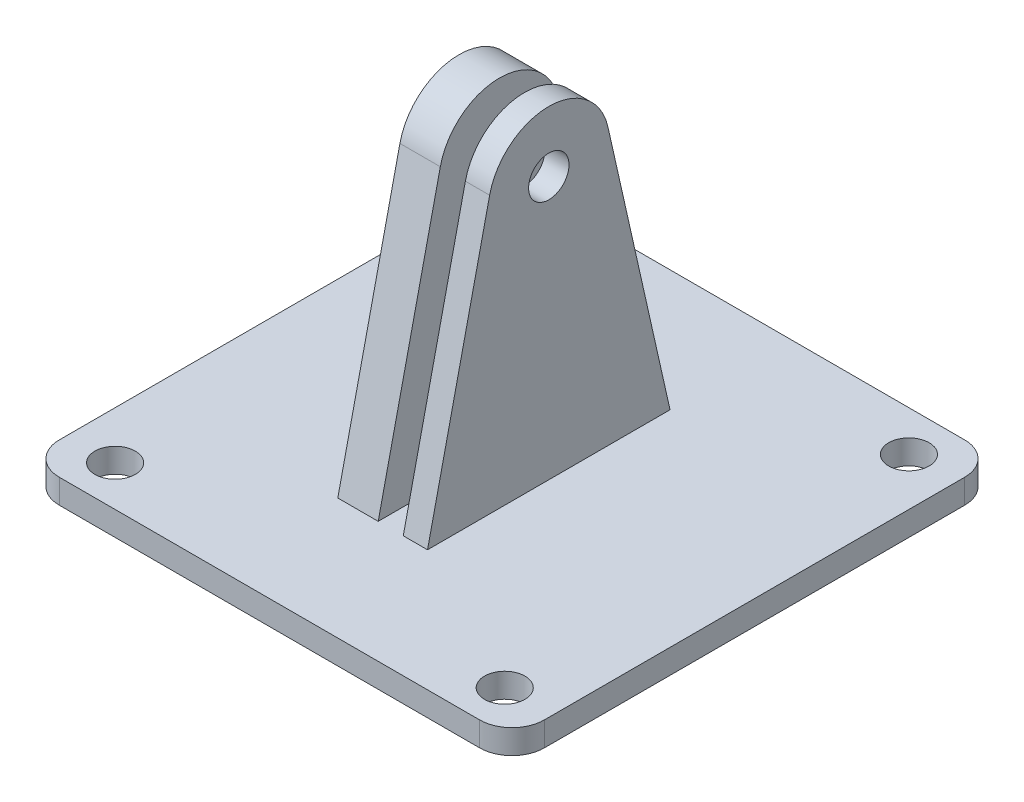
ISO-10303-21;
HEADER;
FILE_DESCRIPTION(('STEP AP214'),'2;1');
FILE_NAME('part.step','',(''),(''),'','','');
FILE_SCHEMA(('AUTOMOTIVE_DESIGN { 1 0 10303 214 1 1 1 1 }'));
ENDSEC;
DATA;
#1=APPLICATION_CONTEXT('core data for automotive mechanical design processes');
#2=APPLICATION_PROTOCOL_DEFINITION('international standard','automotive_design',2000,#1);
#3=PRODUCT_CONTEXT('',#1,'mechanical');
#4=PRODUCT('Part','Part','',(#3));
#5=PRODUCT_RELATED_PRODUCT_CATEGORY('part','',(#4));
#6=PRODUCT_DEFINITION_FORMATION('','',#4);
#7=PRODUCT_DEFINITION_CONTEXT('part definition',#1,'design');
#8=PRODUCT_DEFINITION('design','',#6,#7);
#9=PRODUCT_DEFINITION_SHAPE('','',#8);
#10=(LENGTH_UNIT() NAMED_UNIT(*) SI_UNIT(.MILLI.,.METRE.));
#11=(NAMED_UNIT(*) PLANE_ANGLE_UNIT() SI_UNIT($,.RADIAN.));
#12=(NAMED_UNIT(*) SI_UNIT($,.STERADIAN.) SOLID_ANGLE_UNIT());
#13=UNCERTAINTY_MEASURE_WITH_UNIT(LENGTH_MEASURE(1.E-05),#10,'distance_accuracy_value','');
#14=(GEOMETRIC_REPRESENTATION_CONTEXT(3) GLOBAL_UNCERTAINTY_ASSIGNED_CONTEXT((#13)) GLOBAL_UNIT_ASSIGNED_CONTEXT((#10,
#11,#12)) REPRESENTATION_CONTEXT('',''));
#15=CARTESIAN_POINT('',(0.,0.,0.));
#16=DIRECTION('',(0.,0.,1.));
#17=DIRECTION('',(1.,0.,0.));
#18=AXIS2_PLACEMENT_3D('',#15,#16,#17);
#19=CARTESIAN_POINT('',(-15.,35.5,0.));
#20=DIRECTION('',(1.,0.,0.));
#21=DIRECTION('',(0.,0.,-1.));
#22=AXIS2_PLACEMENT_3D('',#19,#20,#21);
#23=CYLINDRICAL_SURFACE('',#22,2.5);
#24=CARTESIAN_POINT('',(-1.55,35.5,0.));
#25=DIRECTION('',(1.,0.,0.));
#26=DIRECTION('',(0.,0.,-1.));
#27=AXIS2_PLACEMENT_3D('',#24,#25,#26);
#28=CIRCLE('',#27,2.5);
#29=CARTESIAN_POINT('',(-1.55,35.5,-2.5));
#30=VERTEX_POINT('',#29);
#31=EDGE_CURVE('E248',#30,#30,#28,.T.);
#32=ORIENTED_EDGE('',*,*,#31,.T.);
#33=EDGE_LOOP('',(#32));
#34=FACE_BOUND('',#33,.T.);
#35=CARTESIAN_POINT('',(-3.55,35.5,0.));
#36=DIRECTION('',(-1.,0.,0.));
#37=DIRECTION('',(0.,0.,1.));
#38=AXIS2_PLACEMENT_3D('',#35,#36,#37);
#39=CIRCLE('',#38,2.5);
#40=CARTESIAN_POINT('',(-3.55,35.5,2.5));
#41=VERTEX_POINT('',#40);
#42=EDGE_CURVE('E41',#41,#41,#39,.F.);
#43=ORIENTED_EDGE('',*,*,#42,.F.);
#44=EDGE_LOOP('',(#43));
#45=FACE_BOUND('',#44,.T.);
#46=ADVANCED_FACE('F37',(#34,#45),#23,.F.);
#47=CARTESIAN_POINT('',(-15.,35.5,0.));
#48=DIRECTION('',(1.,0.,0.));
#49=DIRECTION('',(0.,0.,-1.));
#50=AXIS2_PLACEMENT_3D('',#47,#48,#49);
#51=CYLINDRICAL_SURFACE('',#50,7.5);
#52=DIRECTION('',(1.,0.,0.));
#53=VECTOR('',#52,1.);
#54=CARTESIAN_POINT('',(-15.,37.1463414634146,-7.3170731707317));
#55=LINE('',#54,#53);
#56=CARTESIAN_POINT('',(-6.55,37.1463414634146,-7.3170731707317));
#57=VERTEX_POINT('',#56);
#58=CARTESIAN_POINT('',(-1.55,37.1463414634146,-7.3170731707317));
#59=VERTEX_POINT('',#58);
#60=EDGE_CURVE('E279',#57,#59,#55,.T.);
#61=ORIENTED_EDGE('',*,*,#60,.F.);
#62=CARTESIAN_POINT('',(-6.55,35.5,0.));
#63=DIRECTION('',(-1.,0.,0.));
#64=DIRECTION('',(0.,0.,1.));
#65=AXIS2_PLACEMENT_3D('',#62,#63,#64);
#66=CIRCLE('',#65,7.5);
#67=CARTESIAN_POINT('',(-6.55,37.1463414634146,7.31707317073171));
#68=VERTEX_POINT('',#67);
#69=EDGE_CURVE('E272',#68,#57,#66,.T.);
#70=ORIENTED_EDGE('',*,*,#69,.F.);
#71=DIRECTION('',(1.,0.,0.));
#72=VECTOR('',#71,1.);
#73=CARTESIAN_POINT('',(-15.,37.1463414634146,7.31707317073171));
#74=LINE('',#73,#72);
#75=CARTESIAN_POINT('',(-1.55,37.1463414634146,7.31707317073171));
#76=VERTEX_POINT('',#75);
#77=EDGE_CURVE('E283',#68,#76,#74,.T.);
#78=ORIENTED_EDGE('',*,*,#77,.T.);
#79=CARTESIAN_POINT('',(-1.55,35.5,0.));
#80=DIRECTION('',(1.,0.,0.));
#81=DIRECTION('',(0.,0.,-1.));
#82=AXIS2_PLACEMENT_3D('',#79,#80,#81);
#83=CIRCLE('',#82,7.5);
#84=EDGE_CURVE('E264',#59,#76,#83,.T.);
#85=ORIENTED_EDGE('',*,*,#84,.F.);
#86=EDGE_LOOP('',(#61,#70,#78,#85));
#87=FACE_BOUND('',#86,.T.);
#88=ADVANCED_FACE('F420',(#87),#51,.T.);
#89=CARTESIAN_POINT('',(4.55,35.5,0.));
#90=DIRECTION('',(1.,0.,0.));
#91=DIRECTION('',(0.,0.,-1.));
#92=AXIS2_PLACEMENT_3D('',#89,#90,#91);
#93=CIRCLE('',#92,7.5);
#94=CARTESIAN_POINT('',(4.55,37.1463414634146,-7.3170731707317));
#95=VERTEX_POINT('',#94);
#96=CARTESIAN_POINT('',(4.55,37.1463414634146,7.31707317073171));
#97=VERTEX_POINT('',#96);
#98=EDGE_CURVE('E268',#95,#97,#93,.T.);
#99=ORIENTED_EDGE('',*,*,#98,.F.);
#100=CARTESIAN_POINT('',(1.55,37.1463414634146,-7.3170731707317));
#101=VERTEX_POINT('',#100);
#102=EDGE_CURVE('E276',#101,#95,#55,.T.);
#103=ORIENTED_EDGE('',*,*,#102,.F.);
#104=CARTESIAN_POINT('',(1.55,35.5,0.));
#105=DIRECTION('',(-1.,0.,0.));
#106=DIRECTION('',(0.,0.,1.));
#107=AXIS2_PLACEMENT_3D('',#104,#105,#106);
#108=CIRCLE('',#107,7.5);
#109=CARTESIAN_POINT('',(1.55,37.1463414634146,7.31707317073171));
#110=VERTEX_POINT('',#109);
#111=EDGE_CURVE('E253',#110,#101,#108,.T.);
#112=ORIENTED_EDGE('',*,*,#111,.F.);
#113=EDGE_CURVE('E280',#110,#97,#74,.T.);
#114=ORIENTED_EDGE('',*,*,#113,.T.);
#115=EDGE_LOOP('',(#99,#103,#112,#114));
#116=FACE_BOUND('',#115,.T.);
#117=ADVANCED_FACE('F393',(#116),#51,.T.);
#118=CARTESIAN_POINT('',(-15.,37.1463414634146,7.31707317073171));
#119=DIRECTION('',(0.,-0.219512195121951,-0.975609756097561));
#120=DIRECTION('',(0.,0.975609756097561,-0.219512195121951));
#121=AXIS2_PLACEMENT_3D('',#118,#119,#120);
#122=PLANE('',#121);
#123=DIRECTION('',(0.,0.975609756097561,-0.219512195121951));
#124=VECTOR('',#123,1.);
#125=CARTESIAN_POINT('',(-6.55,37.1463414634146,7.31707317073171));
#126=LINE('',#125,#124);
#127=CARTESIAN_POINT('',(-6.55,3.,15.));
#128=VERTEX_POINT('',#127);
#129=EDGE_CURVE('E274',#128,#68,#126,.T.);
#130=ORIENTED_EDGE('',*,*,#129,.F.);
#131=DIRECTION('',(1.,0.,0.));
#132=VECTOR('',#131,1.);
#133=CARTESIAN_POINT('',(-15.,3.,15.));
#134=LINE('',#133,#132);
#135=CARTESIAN_POINT('',(-1.55,3.,15.));
#136=VERTEX_POINT('',#135);
#137=EDGE_CURVE('E291',#128,#136,#134,.T.);
#138=ORIENTED_EDGE('',*,*,#137,.T.);
#139=DIRECTION('',(0.,-0.975609756097561,0.219512195121951));
#140=VECTOR('',#139,1.);
#141=CARTESIAN_POINT('',(-1.55,37.1463414634146,7.31707317073171));
#142=LINE('',#141,#140);
#143=EDGE_CURVE('E266',#76,#136,#142,.T.);
#144=ORIENTED_EDGE('',*,*,#143,.F.);
#145=ORIENTED_EDGE('',*,*,#77,.F.);
#146=EDGE_LOOP('',(#130,#138,#144,#145));
#147=FACE_BOUND('',#146,.T.);
#148=ADVANCED_FACE('F456',(#147),#122,.F.);
#149=DIRECTION('',(0.,-0.975609756097561,0.219512195121951));
#150=VECTOR('',#149,1.);
#151=CARTESIAN_POINT('',(4.55,37.1463414634146,7.31707317073171));
#152=LINE('',#151,#150);
#153=CARTESIAN_POINT('',(4.55,3.,15.));
#154=VERTEX_POINT('',#153);
#155=EDGE_CURVE('E270',#97,#154,#152,.T.);
#156=ORIENTED_EDGE('',*,*,#155,.F.);
#157=ORIENTED_EDGE('',*,*,#113,.F.);
#158=DIRECTION('',(0.,0.975609756097561,-0.219512195121951));
#159=VECTOR('',#158,1.);
#160=CARTESIAN_POINT('',(1.55,37.1463414634146,7.31707317073171));
#161=LINE('',#160,#159);
#162=CARTESIAN_POINT('',(1.55,3.,15.));
#163=VERTEX_POINT('',#162);
#164=EDGE_CURVE('E262',#163,#110,#161,.T.);
#165=ORIENTED_EDGE('',*,*,#164,.F.);
#166=EDGE_CURVE('E288',#163,#154,#134,.T.);
#167=ORIENTED_EDGE('',*,*,#166,.T.);
#168=EDGE_LOOP('',(#156,#157,#165,#167));
#169=FACE_BOUND('',#168,.T.);
#170=ADVANCED_FACE('F397',(#169),#122,.F.);
#171=CARTESIAN_POINT('',(-15.,37.1463414634146,-7.3170731707317));
#172=DIRECTION('',(0.,-0.219512195121951,0.975609756097561));
#173=DIRECTION('',(0.,-0.975609756097561,-0.219512195121951));
#174=AXIS2_PLACEMENT_3D('',#171,#172,#173);
#175=PLANE('',#174);
#176=DIRECTION('',(0.,-0.975609756097561,-0.219512195121951));
#177=VECTOR('',#176,1.);
#178=CARTESIAN_POINT('',(-6.55,37.1463414634146,-7.3170731707317));
#179=LINE('',#178,#177);
#180=CARTESIAN_POINT('',(-6.55,3.,-15.));
#181=VERTEX_POINT('',#180);
#182=EDGE_CURVE('E11',#57,#181,#179,.T.);
#183=ORIENTED_EDGE('',*,*,#182,.F.);
#184=ORIENTED_EDGE('',*,*,#60,.T.);
#185=DIRECTION('',(0.,0.975609756097561,0.219512195121951));
#186=VECTOR('',#185,1.);
#187=CARTESIAN_POINT('',(-1.55,37.1463414634146,-7.3170731707317));
#188=LINE('',#187,#186);
#189=CARTESIAN_POINT('',(-1.55,3.,-15.));
#190=VERTEX_POINT('',#189);
#191=EDGE_CURVE('E377',#190,#59,#188,.T.);
#192=ORIENTED_EDGE('',*,*,#191,.F.);
#193=DIRECTION('',(-1.,0.,0.));
#194=VECTOR('',#193,1.);
#195=CARTESIAN_POINT('',(-15.,3.,-15.));
#196=LINE('',#195,#194);
#197=EDGE_CURVE('E284',#190,#181,#196,.T.);
#198=ORIENTED_EDGE('',*,*,#197,.T.);
#199=EDGE_LOOP('',(#183,#184,#192,#198));
#200=FACE_BOUND('',#199,.T.);
#201=ADVANCED_FACE('F460',(#200),#175,.F.);
#202=DIRECTION('',(0.,0.975609756097561,0.219512195121951));
#203=VECTOR('',#202,1.);
#204=CARTESIAN_POINT('',(4.55,37.1463414634146,-7.3170731707317));
#205=LINE('',#204,#203);
#206=CARTESIAN_POINT('',(4.55,3.,-15.));
#207=VERTEX_POINT('',#206);
#208=EDGE_CURVE('E46',#207,#95,#205,.T.);
#209=ORIENTED_EDGE('',*,*,#208,.F.);
#210=CARTESIAN_POINT('',(1.55,3.,-15.));
#211=VERTEX_POINT('',#210);
#212=EDGE_CURVE('E287',#207,#211,#196,.T.);
#213=ORIENTED_EDGE('',*,*,#212,.T.);
#214=DIRECTION('',(0.,-0.975609756097561,-0.219512195121951));
#215=VECTOR('',#214,1.);
#216=CARTESIAN_POINT('',(1.55,37.1463414634146,-7.3170731707317));
#217=LINE('',#216,#215);
#218=EDGE_CURVE('E374',#101,#211,#217,.T.);
#219=ORIENTED_EDGE('',*,*,#218,.F.);
#220=ORIENTED_EDGE('',*,*,#102,.T.);
#221=EDGE_LOOP('',(#209,#213,#219,#220));
#222=FACE_BOUND('',#221,.T.);
#223=ADVANCED_FACE('F390',(#222),#175,.F.);
#224=CARTESIAN_POINT('',(26.,3.,-26.));
#225=DIRECTION('',(0.,-1.,0.));
#226=DIRECTION('',(0.,0.,-1.));
#227=AXIS2_PLACEMENT_3D('',#224,#225,#226);
#228=PLANE('',#227);
#229=ORIENTED_EDGE('',*,*,#137,.F.);
#230=DIRECTION('',(0.,0.,-1.));
#231=VECTOR('',#230,1.);
#232=CARTESIAN_POINT('',(-6.55,3.,-15.));
#233=LINE('',#232,#231);
#234=EDGE_CURVE('E61',#128,#181,#233,.T.);
#235=ORIENTED_EDGE('',*,*,#234,.T.);
#236=ORIENTED_EDGE('',*,*,#197,.F.);
#237=DIRECTION('',(0.,0.,1.));
#238=VECTOR('',#237,1.);
#239=CARTESIAN_POINT('',(-1.55,3.,15.));
#240=LINE('',#239,#238);
#241=EDGE_CURVE('E251',#190,#136,#240,.T.);
#242=ORIENTED_EDGE('',*,*,#241,.T.);
#243=EDGE_LOOP('',(#229,#235,#236,#242));
#244=FACE_BOUND('',#243,.T.);
#245=ORIENTED_EDGE('',*,*,#166,.F.);
#246=DIRECTION('',(0.,0.,-1.));
#247=VECTOR('',#246,1.);
#248=CARTESIAN_POINT('',(1.55,3.,15.));
#249=LINE('',#248,#247);
#250=EDGE_CURVE('E257',#163,#211,#249,.T.);
#251=ORIENTED_EDGE('',*,*,#250,.T.);
#252=ORIENTED_EDGE('',*,*,#212,.F.);
#253=DIRECTION('',(0.,0.,1.));
#254=VECTOR('',#253,1.);
#255=CARTESIAN_POINT('',(4.55,3.,-15.));
#256=LINE('',#255,#254);
#257=EDGE_CURVE('E254',#207,#154,#256,.T.);
#258=ORIENTED_EDGE('',*,*,#257,.T.);
#259=EDGE_LOOP('',(#245,#251,#252,#258));
#260=FACE_BOUND('',#259,.T.);
#261=CARTESIAN_POINT('',(24.1,3.,25.));
#262=DIRECTION('',(0.,1.,0.));
#263=DIRECTION('',(0.,0.,1.));
#264=AXIS2_PLACEMENT_3D('',#261,#262,#263);
#265=CIRCLE('',#264,2.5);
#266=CARTESIAN_POINT('',(24.1,3.,27.5));
#267=VERTEX_POINT('',#266);
#268=EDGE_CURVE('E292',#267,#267,#265,.T.);
#269=ORIENTED_EDGE('',*,*,#268,.F.);
#270=EDGE_LOOP('',(#269));
#271=FACE_BOUND('',#270,.T.);
#272=CARTESIAN_POINT('',(-24.1,3.,25.));
#273=DIRECTION('',(0.,1.,0.));
#274=DIRECTION('',(0.,0.,1.));
#275=AXIS2_PLACEMENT_3D('',#272,#273,#274);
#276=CIRCLE('',#275,2.5);
#277=CARTESIAN_POINT('',(-24.1,3.,27.5));
#278=VERTEX_POINT('',#277);
#279=EDGE_CURVE('E299',#278,#278,#276,.T.);
#280=ORIENTED_EDGE('',*,*,#279,.F.);
#281=EDGE_LOOP('',(#280));
#282=FACE_BOUND('',#281,.T.);
#283=CARTESIAN_POINT('',(24.1,3.,-25.));
#284=DIRECTION('',(0.,1.,0.));
#285=DIRECTION('',(0.,0.,1.));
#286=AXIS2_PLACEMENT_3D('',#283,#284,#285);
#287=CIRCLE('',#286,2.5);
#288=CARTESIAN_POINT('',(24.1,3.,-22.5));
#289=VERTEX_POINT('',#288);
#290=EDGE_CURVE('E305',#289,#289,#287,.T.);
#291=ORIENTED_EDGE('',*,*,#290,.F.);
#292=EDGE_LOOP('',(#291));
#293=FACE_BOUND('',#292,.T.);
#294=CARTESIAN_POINT('',(-24.1,3.,-25.));
#295=DIRECTION('',(0.,1.,0.));
#296=DIRECTION('',(0.,0.,1.));
#297=AXIS2_PLACEMENT_3D('',#294,#295,#296);
#298=CIRCLE('',#297,2.5);
#299=CARTESIAN_POINT('',(-24.1,3.,-22.5));
#300=VERTEX_POINT('',#299);
#301=EDGE_CURVE('E311',#300,#300,#298,.T.);
#302=ORIENTED_EDGE('',*,*,#301,.F.);
#303=EDGE_LOOP('',(#302));
#304=FACE_BOUND('',#303,.T.);
#305=CARTESIAN_POINT('',(26.,3.,-26.));
#306=DIRECTION('',(0.,1.,0.));
#307=DIRECTION('',(0.,0.,-1.));
#308=AXIS2_PLACEMENT_3D('',#305,#306,#307);
#309=CIRCLE('',#308,4.);
#310=CARTESIAN_POINT('',(30.,3.,-26.));
#311=VERTEX_POINT('',#310);
#312=CARTESIAN_POINT('',(26.,3.,-30.));
#313=VERTEX_POINT('',#312);
#314=EDGE_CURVE('E317',#311,#313,#309,.T.);
#315=ORIENTED_EDGE('',*,*,#314,.T.);
#316=DIRECTION('',(-1.,0.,0.));
#317=VECTOR('',#316,1.);
#318=CARTESIAN_POINT('',(-26.,3.,-30.));
#319=LINE('',#318,#317);
#320=CARTESIAN_POINT('',(-26.,3.,-30.));
#321=VERTEX_POINT('',#320);
#322=EDGE_CURVE('E320',#313,#321,#319,.T.);
#323=ORIENTED_EDGE('',*,*,#322,.T.);
#324=CARTESIAN_POINT('',(-26.,3.,-26.));
#325=DIRECTION('',(0.,1.,0.));
#326=DIRECTION('',(0.,0.,-1.));
#327=AXIS2_PLACEMENT_3D('',#324,#325,#326);
#328=CIRCLE('',#327,4.);
#329=CARTESIAN_POINT('',(-30.,3.,-26.));
#330=VERTEX_POINT('',#329);
#331=EDGE_CURVE('E323',#321,#330,#328,.T.);
#332=ORIENTED_EDGE('',*,*,#331,.T.);
#333=DIRECTION('',(0.,0.,1.));
#334=VECTOR('',#333,1.);
#335=CARTESIAN_POINT('',(-30.,3.,26.));
#336=LINE('',#335,#334);
#337=CARTESIAN_POINT('',(-30.,3.,26.));
#338=VERTEX_POINT('',#337);
#339=EDGE_CURVE('E325',#330,#338,#336,.T.);
#340=ORIENTED_EDGE('',*,*,#339,.T.);
#341=CARTESIAN_POINT('',(-26.,3.,26.));
#342=DIRECTION('',(0.,1.,0.));
#343=DIRECTION('',(0.,0.,-1.));
#344=AXIS2_PLACEMENT_3D('',#341,#342,#343);
#345=CIRCLE('',#344,4.);
#346=CARTESIAN_POINT('',(-26.,3.,30.));
#347=VERTEX_POINT('',#346);
#348=EDGE_CURVE('E327',#338,#347,#345,.T.);
#349=ORIENTED_EDGE('',*,*,#348,.T.);
#350=DIRECTION('',(1.,0.,0.));
#351=VECTOR('',#350,1.);
#352=CARTESIAN_POINT('',(-26.,3.,30.));
#353=LINE('',#352,#351);
#354=CARTESIAN_POINT('',(26.,3.,30.));
#355=VERTEX_POINT('',#354);
#356=EDGE_CURVE('E329',#347,#355,#353,.T.);
#357=ORIENTED_EDGE('',*,*,#356,.T.);
#358=CARTESIAN_POINT('',(26.,3.,26.));
#359=DIRECTION('',(0.,1.,0.));
#360=DIRECTION('',(0.,0.,1.));
#361=AXIS2_PLACEMENT_3D('',#358,#359,#360);
#362=CIRCLE('',#361,4.);
#363=CARTESIAN_POINT('',(30.,3.,26.));
#364=VERTEX_POINT('',#363);
#365=EDGE_CURVE('E331',#355,#364,#362,.T.);
#366=ORIENTED_EDGE('',*,*,#365,.T.);
#367=DIRECTION('',(0.,0.,-1.));
#368=VECTOR('',#367,1.);
#369=CARTESIAN_POINT('',(30.,3.,26.));
#370=LINE('',#369,#368);
#371=EDGE_CURVE('E333',#364,#311,#370,.T.);
#372=ORIENTED_EDGE('',*,*,#371,.T.);
#373=EDGE_LOOP('',(#315,#323,#332,#340,#349,#357,#366,#372));
#374=FACE_BOUND('',#373,.T.);
#375=ADVANCED_FACE('F400',(#244,#260,#271,#282,#293,#304,#374),#228,.F.);
#376=CARTESIAN_POINT('',(26.,0.,-26.));
#377=DIRECTION('',(0.,-1.,0.));
#378=DIRECTION('',(0.,0.,-1.));
#379=AXIS2_PLACEMENT_3D('',#376,#377,#378);
#380=PLANE('',#379);
#381=CARTESIAN_POINT('',(-24.1,0.,25.));
#382=DIRECTION('',(0.,1.,0.));
#383=DIRECTION('',(0.,0.,1.));
#384=AXIS2_PLACEMENT_3D('',#381,#382,#383);
#385=CIRCLE('',#384,2.5);
#386=CARTESIAN_POINT('',(-24.1,0.,27.5));
#387=VERTEX_POINT('',#386);
#388=EDGE_CURVE('E295',#387,#387,#385,.T.);
#389=ORIENTED_EDGE('',*,*,#388,.T.);
#390=EDGE_LOOP('',(#389));
#391=FACE_BOUND('',#390,.T.);
#392=CARTESIAN_POINT('',(-24.1,0.,-25.));
#393=DIRECTION('',(0.,1.,0.));
#394=DIRECTION('',(0.,0.,1.));
#395=AXIS2_PLACEMENT_3D('',#392,#393,#394);
#396=CIRCLE('',#395,2.5);
#397=CARTESIAN_POINT('',(-24.1,0.,-22.5));
#398=VERTEX_POINT('',#397);
#399=EDGE_CURVE('E308',#398,#398,#396,.T.);
#400=ORIENTED_EDGE('',*,*,#399,.T.);
#401=EDGE_LOOP('',(#400));
#402=FACE_BOUND('',#401,.T.);
#403=CARTESIAN_POINT('',(26.,0.,-26.));
#404=DIRECTION('',(0.,1.,0.));
#405=DIRECTION('',(0.,0.,-1.));
#406=AXIS2_PLACEMENT_3D('',#403,#404,#405);
#407=CIRCLE('',#406,4.);
#408=CARTESIAN_POINT('',(30.,0.,-26.));
#409=VERTEX_POINT('',#408);
#410=CARTESIAN_POINT('',(26.,0.,-30.));
#411=VERTEX_POINT('',#410);
#412=EDGE_CURVE('E314',#409,#411,#407,.T.);
#413=ORIENTED_EDGE('',*,*,#412,.F.);
#414=DIRECTION('',(0.,0.,-1.));
#415=VECTOR('',#414,1.);
#416=CARTESIAN_POINT('',(30.,0.,26.));
#417=LINE('',#416,#415);
#418=CARTESIAN_POINT('',(30.,0.,26.));
#419=VERTEX_POINT('',#418);
#420=EDGE_CURVE('E321',#419,#409,#417,.T.);
#421=ORIENTED_EDGE('',*,*,#420,.F.);
#422=CARTESIAN_POINT('',(26.,0.,26.));
#423=DIRECTION('',(0.,1.,0.));
#424=DIRECTION('',(0.,0.,1.));
#425=AXIS2_PLACEMENT_3D('',#422,#423,#424);
#426=CIRCLE('',#425,4.);
#427=CARTESIAN_POINT('',(26.,0.,30.));
#428=VERTEX_POINT('',#427);
#429=EDGE_CURVE('E348',#428,#419,#426,.T.);
#430=ORIENTED_EDGE('',*,*,#429,.F.);
#431=DIRECTION('',(1.,0.,0.));
#432=VECTOR('',#431,1.);
#433=CARTESIAN_POINT('',(-26.,0.,30.));
#434=LINE('',#433,#432);
#435=CARTESIAN_POINT('',(-26.,0.,30.));
#436=VERTEX_POINT('',#435);
#437=EDGE_CURVE('E346',#436,#428,#434,.T.);
#438=ORIENTED_EDGE('',*,*,#437,.F.);
#439=CARTESIAN_POINT('',(-26.,0.,26.));
#440=DIRECTION('',(0.,1.,0.));
#441=DIRECTION('',(0.,0.,-1.));
#442=AXIS2_PLACEMENT_3D('',#439,#440,#441);
#443=CIRCLE('',#442,4.);
#444=CARTESIAN_POINT('',(-30.,0.,26.));
#445=VERTEX_POINT('',#444);
#446=EDGE_CURVE('E344',#445,#436,#443,.T.);
#447=ORIENTED_EDGE('',*,*,#446,.F.);
#448=DIRECTION('',(0.,0.,1.));
#449=VECTOR('',#448,1.);
#450=CARTESIAN_POINT('',(-30.,0.,26.));
#451=LINE('',#450,#449);
#452=CARTESIAN_POINT('',(-30.,0.,-26.));
#453=VERTEX_POINT('',#452);
#454=EDGE_CURVE('E342',#453,#445,#451,.T.);
#455=ORIENTED_EDGE('',*,*,#454,.F.);
#456=CARTESIAN_POINT('',(-26.,0.,-26.));
#457=DIRECTION('',(0.,1.,0.));
#458=DIRECTION('',(0.,0.,-1.));
#459=AXIS2_PLACEMENT_3D('',#456,#457,#458);
#460=CIRCLE('',#459,4.);
#461=CARTESIAN_POINT('',(-26.,0.,-30.));
#462=VERTEX_POINT('',#461);
#463=EDGE_CURVE('E340',#462,#453,#460,.T.);
#464=ORIENTED_EDGE('',*,*,#463,.F.);
#465=DIRECTION('',(-1.,0.,0.));
#466=VECTOR('',#465,1.);
#467=CARTESIAN_POINT('',(-26.,0.,-30.));
#468=LINE('',#467,#466);
#469=EDGE_CURVE('E338',#411,#462,#468,.T.);
#470=ORIENTED_EDGE('',*,*,#469,.F.);
#471=EDGE_LOOP('',(#413,#421,#430,#438,#447,#455,#464,#470));
#472=FACE_BOUND('',#471,.T.);
#473=CARTESIAN_POINT('',(24.1,0.,-25.));
#474=DIRECTION('',(0.,1.,0.));
#475=DIRECTION('',(0.,0.,1.));
#476=AXIS2_PLACEMENT_3D('',#473,#474,#475);
#477=CIRCLE('',#476,2.5);
#478=CARTESIAN_POINT('',(24.1,0.,-22.5));
#479=VERTEX_POINT('',#478);
#480=EDGE_CURVE('E302',#479,#479,#477,.T.);
#481=ORIENTED_EDGE('',*,*,#480,.T.);
#482=EDGE_LOOP('',(#481));
#483=FACE_BOUND('',#482,.T.);
#484=CARTESIAN_POINT('',(24.1,0.,25.));
#485=DIRECTION('',(0.,1.,0.));
#486=DIRECTION('',(0.,0.,1.));
#487=AXIS2_PLACEMENT_3D('',#484,#485,#486);
#488=CIRCLE('',#487,2.5);
#489=CARTESIAN_POINT('',(24.1,0.,27.5));
#490=VERTEX_POINT('',#489);
#491=EDGE_CURVE('E296',#490,#490,#488,.T.);
#492=ORIENTED_EDGE('',*,*,#491,.T.);
#493=EDGE_LOOP('',(#492));
#494=FACE_BOUND('',#493,.T.);
#495=ADVANCED_FACE('F488',(#391,#402,#472,#483,#494),#380,.T.);
#496=CARTESIAN_POINT('',(26.,3.,-26.));
#497=DIRECTION('',(0.,-1.,0.));
#498=DIRECTION('',(0.,0.,-1.));
#499=AXIS2_PLACEMENT_3D('',#496,#497,#498);
#500=CYLINDRICAL_SURFACE('',#499,4.);
#501=ORIENTED_EDGE('',*,*,#412,.T.);
#502=DIRECTION('',(0.,-1.,0.));
#503=VECTOR('',#502,1.);
#504=CARTESIAN_POINT('',(26.,3.,-30.));
#505=LINE('',#504,#503);
#506=EDGE_CURVE('E371',#313,#411,#505,.T.);
#507=ORIENTED_EDGE('',*,*,#506,.F.);
#508=ORIENTED_EDGE('',*,*,#314,.F.);
#509=DIRECTION('',(0.,-1.,0.));
#510=VECTOR('',#509,1.);
#511=CARTESIAN_POINT('',(30.,3.,-26.));
#512=LINE('',#511,#510);
#513=EDGE_CURVE('E335',#311,#409,#512,.T.);
#514=ORIENTED_EDGE('',*,*,#513,.T.);
#515=EDGE_LOOP('',(#501,#507,#508,#514));
#516=FACE_BOUND('',#515,.T.);
#517=ADVANCED_FACE('F39',(#516),#500,.T.);
#518=CARTESIAN_POINT('',(-26.,3.,-30.));
#519=DIRECTION('',(0.,0.,1.));
#520=DIRECTION('',(1.,0.,0.));
#521=AXIS2_PLACEMENT_3D('',#518,#519,#520);
#522=PLANE('',#521);
#523=ORIENTED_EDGE('',*,*,#469,.T.);
#524=DIRECTION('',(0.,-1.,0.));
#525=VECTOR('',#524,1.);
#526=CARTESIAN_POINT('',(-26.,3.,-30.));
#527=LINE('',#526,#525);
#528=EDGE_CURVE('E368',#321,#462,#527,.T.);
#529=ORIENTED_EDGE('',*,*,#528,.F.);
#530=ORIENTED_EDGE('',*,*,#322,.F.);
#531=ORIENTED_EDGE('',*,*,#506,.T.);
#532=EDGE_LOOP('',(#523,#529,#530,#531));
#533=FACE_BOUND('',#532,.T.);
#534=ADVANCED_FACE('F513',(#533),#522,.F.);
#535=CARTESIAN_POINT('',(-26.,3.,-26.));
#536=DIRECTION('',(0.,-1.,0.));
#537=DIRECTION('',(0.,0.,-1.));
#538=AXIS2_PLACEMENT_3D('',#535,#536,#537);
#539=CYLINDRICAL_SURFACE('',#538,4.);
#540=ORIENTED_EDGE('',*,*,#463,.T.);
#541=DIRECTION('',(0.,-1.,0.));
#542=VECTOR('',#541,1.);
#543=CARTESIAN_POINT('',(-30.,3.,-26.));
#544=LINE('',#543,#542);
#545=EDGE_CURVE('E365',#330,#453,#544,.T.);
#546=ORIENTED_EDGE('',*,*,#545,.F.);
#547=ORIENTED_EDGE('',*,*,#331,.F.);
#548=ORIENTED_EDGE('',*,*,#528,.T.);
#549=EDGE_LOOP('',(#540,#546,#547,#548));
#550=FACE_BOUND('',#549,.T.);
#551=ADVANCED_FACE('F510',(#550),#539,.T.);
#552=CARTESIAN_POINT('',(-30.,3.,26.));
#553=DIRECTION('',(1.,0.,0.));
#554=DIRECTION('',(0.,0.,-1.));
#555=AXIS2_PLACEMENT_3D('',#552,#553,#554);
#556=PLANE('',#555);
#557=ORIENTED_EDGE('',*,*,#454,.T.);
#558=DIRECTION('',(0.,-1.,0.));
#559=VECTOR('',#558,1.);
#560=CARTESIAN_POINT('',(-30.,3.,26.));
#561=LINE('',#560,#559);
#562=EDGE_CURVE('E362',#338,#445,#561,.T.);
#563=ORIENTED_EDGE('',*,*,#562,.F.);
#564=ORIENTED_EDGE('',*,*,#339,.F.);
#565=ORIENTED_EDGE('',*,*,#545,.T.);
#566=EDGE_LOOP('',(#557,#563,#564,#565));
#567=FACE_BOUND('',#566,.T.);
#568=ADVANCED_FACE('F506',(#567),#556,.F.);
#569=CARTESIAN_POINT('',(-26.,3.,26.));
#570=DIRECTION('',(0.,-1.,0.));
#571=DIRECTION('',(0.,0.,-1.));
#572=AXIS2_PLACEMENT_3D('',#569,#570,#571);
#573=CYLINDRICAL_SURFACE('',#572,4.);
#574=ORIENTED_EDGE('',*,*,#446,.T.);
#575=DIRECTION('',(0.,-1.,0.));
#576=VECTOR('',#575,1.);
#577=CARTESIAN_POINT('',(-26.,3.,30.));
#578=LINE('',#577,#576);
#579=EDGE_CURVE('E359',#347,#436,#578,.T.);
#580=ORIENTED_EDGE('',*,*,#579,.F.);
#581=ORIENTED_EDGE('',*,*,#348,.F.);
#582=ORIENTED_EDGE('',*,*,#562,.T.);
#583=EDGE_LOOP('',(#574,#580,#581,#582));
#584=FACE_BOUND('',#583,.T.);
#585=ADVANCED_FACE('F502',(#584),#573,.T.);
#586=CARTESIAN_POINT('',(-26.,3.,30.));
#587=DIRECTION('',(0.,0.,-1.));
#588=DIRECTION('',(-1.,0.,0.));
#589=AXIS2_PLACEMENT_3D('',#586,#587,#588);
#590=PLANE('',#589);
#591=ORIENTED_EDGE('',*,*,#437,.T.);
#592=DIRECTION('',(0.,-1.,0.));
#593=VECTOR('',#592,1.);
#594=CARTESIAN_POINT('',(26.,3.,30.));
#595=LINE('',#594,#593);
#596=EDGE_CURVE('E356',#355,#428,#595,.T.);
#597=ORIENTED_EDGE('',*,*,#596,.F.);
#598=ORIENTED_EDGE('',*,*,#356,.F.);
#599=ORIENTED_EDGE('',*,*,#579,.T.);
#600=EDGE_LOOP('',(#591,#597,#598,#599));
#601=FACE_BOUND('',#600,.T.);
#602=ADVANCED_FACE('F498',(#601),#590,.F.);
#603=CARTESIAN_POINT('',(26.,3.,26.));
#604=DIRECTION('',(0.,-1.,0.));
#605=DIRECTION('',(0.,0.,-1.));
#606=AXIS2_PLACEMENT_3D('',#603,#604,#605);
#607=CYLINDRICAL_SURFACE('',#606,4.);
#608=ORIENTED_EDGE('',*,*,#429,.T.);
#609=DIRECTION('',(0.,-1.,0.));
#610=VECTOR('',#609,1.);
#611=CARTESIAN_POINT('',(30.,3.,26.));
#612=LINE('',#611,#610);
#613=EDGE_CURVE('E353',#364,#419,#612,.T.);
#614=ORIENTED_EDGE('',*,*,#613,.F.);
#615=ORIENTED_EDGE('',*,*,#365,.F.);
#616=ORIENTED_EDGE('',*,*,#596,.T.);
#617=EDGE_LOOP('',(#608,#614,#615,#616));
#618=FACE_BOUND('',#617,.T.);
#619=ADVANCED_FACE('F494',(#618),#607,.T.);
#620=CARTESIAN_POINT('',(30.,3.,26.));
#621=DIRECTION('',(-1.,0.,0.));
#622=DIRECTION('',(0.,0.,1.));
#623=AXIS2_PLACEMENT_3D('',#620,#621,#622);
#624=PLANE('',#623);
#625=ORIENTED_EDGE('',*,*,#420,.T.);
#626=ORIENTED_EDGE('',*,*,#513,.F.);
#627=ORIENTED_EDGE('',*,*,#371,.F.);
#628=ORIENTED_EDGE('',*,*,#613,.T.);
#629=EDGE_LOOP('',(#625,#626,#627,#628));
#630=FACE_BOUND('',#629,.T.);
#631=ADVANCED_FACE('F484',(#630),#624,.F.);
#632=CARTESIAN_POINT('',(-24.1,3.,-25.));
#633=DIRECTION('',(0.,-1.,0.));
#634=DIRECTION('',(0.,0.,-1.));
#635=AXIS2_PLACEMENT_3D('',#632,#633,#634);
#636=CYLINDRICAL_SURFACE('',#635,2.5);
#637=ORIENTED_EDGE('',*,*,#301,.T.);
#638=EDGE_LOOP('',(#637));
#639=FACE_BOUND('',#638,.T.);
#640=ORIENTED_EDGE('',*,*,#399,.F.);
#641=EDGE_LOOP('',(#640));
#642=FACE_BOUND('',#641,.T.);
#643=ADVANCED_FACE('F480',(#639,#642),#636,.F.);
#644=CARTESIAN_POINT('',(24.1,3.,-25.));
#645=DIRECTION('',(0.,-1.,0.));
#646=DIRECTION('',(0.,0.,-1.));
#647=AXIS2_PLACEMENT_3D('',#644,#645,#646);
#648=CYLINDRICAL_SURFACE('',#647,2.5);
#649=ORIENTED_EDGE('',*,*,#290,.T.);
#650=EDGE_LOOP('',(#649));
#651=FACE_BOUND('',#650,.T.);
#652=ORIENTED_EDGE('',*,*,#480,.F.);
#653=EDGE_LOOP('',(#652));
#654=FACE_BOUND('',#653,.T.);
#655=ADVANCED_FACE('F476',(#651,#654),#648,.F.);
#656=CARTESIAN_POINT('',(-24.1,3.,25.));
#657=DIRECTION('',(0.,-1.,0.));
#658=DIRECTION('',(0.,0.,-1.));
#659=AXIS2_PLACEMENT_3D('',#656,#657,#658);
#660=CYLINDRICAL_SURFACE('',#659,2.5);
#661=ORIENTED_EDGE('',*,*,#279,.T.);
#662=EDGE_LOOP('',(#661));
#663=FACE_BOUND('',#662,.T.);
#664=ORIENTED_EDGE('',*,*,#388,.F.);
#665=EDGE_LOOP('',(#664));
#666=FACE_BOUND('',#665,.T.);
#667=ADVANCED_FACE('F472',(#663,#666),#660,.F.);
#668=CARTESIAN_POINT('',(24.1,3.,25.));
#669=DIRECTION('',(0.,-1.,0.));
#670=DIRECTION('',(0.,0.,-1.));
#671=AXIS2_PLACEMENT_3D('',#668,#669,#670);
#672=CYLINDRICAL_SURFACE('',#671,2.5);
#673=ORIENTED_EDGE('',*,*,#268,.T.);
#674=EDGE_LOOP('',(#673));
#675=FACE_BOUND('',#674,.T.);
#676=ORIENTED_EDGE('',*,*,#491,.F.);
#677=EDGE_LOOP('',(#676));
#678=FACE_BOUND('',#677,.T.);
#679=ADVANCED_FACE('F415',(#675,#678),#672,.F.);
#680=CARTESIAN_POINT('',(-1.55,43.,15.));
#681=DIRECTION('',(1.,0.,0.));
#682=DIRECTION('',(0.,0.,-1.));
#683=AXIS2_PLACEMENT_3D('',#680,#681,#682);
#684=PLANE('',#683);
#685=ORIENTED_EDGE('',*,*,#31,.F.);
#686=EDGE_LOOP('',(#685));
#687=FACE_BOUND('',#686,.T.);
#688=ORIENTED_EDGE('',*,*,#143,.T.);
#689=ORIENTED_EDGE('',*,*,#241,.F.);
#690=ORIENTED_EDGE('',*,*,#191,.T.);
#691=ORIENTED_EDGE('',*,*,#84,.T.);
#692=EDGE_LOOP('',(#688,#689,#690,#691));
#693=FACE_BOUND('',#692,.T.);
#694=ADVANCED_FACE('F405',(#687,#693),#684,.T.);
#695=CARTESIAN_POINT('',(1.55,43.,15.));
#696=DIRECTION('',(-1.,0.,0.));
#697=DIRECTION('',(0.,0.,1.));
#698=AXIS2_PLACEMENT_3D('',#695,#696,#697);
#699=PLANE('',#698);
#700=CARTESIAN_POINT('',(1.55,35.5,0.));
#701=DIRECTION('',(-1.,0.,0.));
#702=DIRECTION('',(0.,0.,1.));
#703=AXIS2_PLACEMENT_3D('',#700,#701,#702);
#704=CIRCLE('',#703,2.5);
#705=CARTESIAN_POINT('',(1.55,35.5,2.5));
#706=VERTEX_POINT('',#705);
#707=EDGE_CURVE('E245',#706,#706,#704,.T.);
#708=ORIENTED_EDGE('',*,*,#707,.F.);
#709=EDGE_LOOP('',(#708));
#710=FACE_BOUND('',#709,.T.);
#711=ORIENTED_EDGE('',*,*,#164,.T.);
#712=ORIENTED_EDGE('',*,*,#111,.T.);
#713=ORIENTED_EDGE('',*,*,#218,.T.);
#714=ORIENTED_EDGE('',*,*,#250,.F.);
#715=EDGE_LOOP('',(#711,#712,#713,#714));
#716=FACE_BOUND('',#715,.T.);
#717=ADVANCED_FACE('F403',(#710,#716),#699,.T.);
#718=CARTESIAN_POINT('',(4.55,43.,-15.));
#719=DIRECTION('',(1.,0.,0.));
#720=DIRECTION('',(0.,0.,-1.));
#721=AXIS2_PLACEMENT_3D('',#718,#719,#720);
#722=PLANE('',#721);
#723=CARTESIAN_POINT('',(4.55,35.5,0.));
#724=DIRECTION('',(1.,0.,0.));
#725=DIRECTION('',(0.,0.,-1.));
#726=AXIS2_PLACEMENT_3D('',#723,#724,#725);
#727=CIRCLE('',#726,2.5);
#728=CARTESIAN_POINT('',(4.55,35.5,-2.5));
#729=VERTEX_POINT('',#728);
#730=EDGE_CURVE('E242',#729,#729,#727,.T.);
#731=ORIENTED_EDGE('',*,*,#730,.F.);
#732=EDGE_LOOP('',(#731));
#733=FACE_BOUND('',#732,.T.);
#734=ORIENTED_EDGE('',*,*,#155,.T.);
#735=ORIENTED_EDGE('',*,*,#257,.F.);
#736=ORIENTED_EDGE('',*,*,#208,.T.);
#737=ORIENTED_EDGE('',*,*,#98,.T.);
#738=EDGE_LOOP('',(#734,#735,#736,#737));
#739=FACE_BOUND('',#738,.T.);
#740=ADVANCED_FACE('F383',(#733,#739),#722,.T.);
#741=CARTESIAN_POINT('',(-6.55,43.,-15.));
#742=DIRECTION('',(-1.,0.,0.));
#743=DIRECTION('',(0.,0.,1.));
#744=AXIS2_PLACEMENT_3D('',#741,#742,#743);
#745=PLANE('',#744);
#746=DIRECTION('',(0.,-0.499999999999999,-0.866025403784439));
#747=VECTOR('',#746,1.);
#748=CARTESIAN_POINT('',(-6.55,39.55,-2.92410771522237E-13));
#749=LINE('',#748,#747);
#750=CARTESIAN_POINT('',(-6.55,39.55,-2.92410771522237E-13));
#751=VERTEX_POINT('',#750);
#752=CARTESIAN_POINT('',(-6.55,37.525,-3.50740288532727));
#753=VERTEX_POINT('',#752);
#754=EDGE_CURVE('E53',#751,#753,#749,.T.);
#755=ORIENTED_EDGE('',*,*,#754,.F.);
#756=DIRECTION('',(0.,0.5,-0.866025403784439));
#757=VECTOR('',#756,1.);
#758=CARTESIAN_POINT('',(-6.55,37.525,3.50740288532667));
#759=LINE('',#758,#757);
#760=CARTESIAN_POINT('',(-6.55,37.525,3.50740288532667));
#761=VERTEX_POINT('',#760);
#762=EDGE_CURVE('E209',#761,#751,#759,.T.);
#763=ORIENTED_EDGE('',*,*,#762,.F.);
#764=DIRECTION('',(0.,1.,0.));
#765=VECTOR('',#764,1.);
#766=CARTESIAN_POINT('',(-6.55,33.475,3.50740288532667));
#767=LINE('',#766,#765);
#768=CARTESIAN_POINT('',(-6.55,33.475,3.50740288532667));
#769=VERTEX_POINT('',#768);
#770=EDGE_CURVE('E212',#769,#761,#767,.T.);
#771=ORIENTED_EDGE('',*,*,#770,.F.);
#772=DIRECTION('',(0.,0.499999999999968,0.866025403784457));
#773=VECTOR('',#772,1.);
#774=CARTESIAN_POINT('',(-6.55,31.45,-6.08997805888004E-13));
#775=LINE('',#774,#773);
#776=CARTESIAN_POINT('',(-6.55,31.45,-6.08997805888004E-13));
#777=VERTEX_POINT('',#776);
#778=EDGE_CURVE('E228',#777,#769,#775,.T.);
#779=ORIENTED_EDGE('',*,*,#778,.F.);
#780=DIRECTION('',(0.,-0.500000000000033,0.866025403784419));
#781=VECTOR('',#780,1.);
#782=CARTESIAN_POINT('',(-6.55,33.475,-3.50740288532727));
#783=LINE('',#782,#781);
#784=CARTESIAN_POINT('',(-6.55,33.475,-3.50740288532727));
#785=VERTEX_POINT('',#784);
#786=EDGE_CURVE('E225',#785,#777,#783,.T.);
#787=ORIENTED_EDGE('',*,*,#786,.F.);
#788=DIRECTION('',(0.,-1.,0.));
#789=VECTOR('',#788,1.);
#790=CARTESIAN_POINT('',(-6.55,37.525,-3.50740288532727));
#791=LINE('',#790,#789);
#792=EDGE_CURVE('E223',#753,#785,#791,.T.);
#793=ORIENTED_EDGE('',*,*,#792,.F.);
#794=EDGE_LOOP('',(#755,#763,#771,#779,#787,#793));
#795=FACE_BOUND('',#794,.T.);
#796=ORIENTED_EDGE('',*,*,#129,.T.);
#797=ORIENTED_EDGE('',*,*,#69,.T.);
#798=ORIENTED_EDGE('',*,*,#182,.T.);
#799=ORIENTED_EDGE('',*,*,#234,.F.);
#800=EDGE_LOOP('',(#796,#797,#798,#799));
#801=FACE_BOUND('',#800,.T.);
#802=ADVANCED_FACE('F412',(#795,#801),#745,.T.);
#803=ORIENTED_EDGE('',*,*,#707,.T.);
#804=EDGE_LOOP('',(#803));
#805=FACE_BOUND('',#804,.T.);
#806=ORIENTED_EDGE('',*,*,#730,.T.);
#807=EDGE_LOOP('',(#806));
#808=FACE_BOUND('',#807,.T.);
#809=ADVANCED_FACE('F423',(#805,#808),#23,.F.);
#810=CARTESIAN_POINT('',(-3.55,0.,0.));
#811=DIRECTION('',(-1.,0.,0.));
#812=DIRECTION('',(0.,0.,1.));
#813=AXIS2_PLACEMENT_3D('',#810,#811,#812);
#814=PLANE('',#813);
#815=DIRECTION('',(0.,-0.499999999999999,-0.866025403784439));
#816=VECTOR('',#815,1.);
#817=CARTESIAN_POINT('',(-3.55,39.55,-2.92757716217433E-13));
#818=LINE('',#817,#816);
#819=CARTESIAN_POINT('',(-3.55,39.55,-2.92757716217433E-13));
#820=VERTEX_POINT('',#819);
#821=CARTESIAN_POINT('',(-3.55,37.525,-3.50740288532727));
#822=VERTEX_POINT('',#821);
#823=EDGE_CURVE('E189',#820,#822,#818,.T.);
#824=ORIENTED_EDGE('',*,*,#823,.T.);
#825=DIRECTION('',(0.,-1.,0.));
#826=VECTOR('',#825,1.);
#827=CARTESIAN_POINT('',(-3.55,37.525,-3.50740288532727));
#828=LINE('',#827,#826);
#829=CARTESIAN_POINT('',(-3.55,33.475,-3.50740288532727));
#830=VERTEX_POINT('',#829);
#831=EDGE_CURVE('E198',#822,#830,#828,.T.);
#832=ORIENTED_EDGE('',*,*,#831,.T.);
#833=DIRECTION('',(0.,-0.500000000000033,0.866025403784419));
#834=VECTOR('',#833,1.);
#835=CARTESIAN_POINT('',(-3.55,33.475,-3.50740288532727));
#836=LINE('',#835,#834);
#837=CARTESIAN_POINT('',(-3.55,31.45,-6.093447505832E-13));
#838=VERTEX_POINT('',#837);
#839=EDGE_CURVE('E203',#830,#838,#836,.T.);
#840=ORIENTED_EDGE('',*,*,#839,.T.);
#841=DIRECTION('',(0.,0.499999999999968,0.866025403784457));
#842=VECTOR('',#841,1.);
#843=CARTESIAN_POINT('',(-3.55,31.45,-6.093447505832E-13));
#844=LINE('',#843,#842);
#845=CARTESIAN_POINT('',(-3.55,33.475,3.50740288532667));
#846=VERTEX_POINT('',#845);
#847=EDGE_CURVE('E216',#838,#846,#844,.T.);
#848=ORIENTED_EDGE('',*,*,#847,.T.);
#849=DIRECTION('',(0.,1.,0.));
#850=VECTOR('',#849,1.);
#851=CARTESIAN_POINT('',(-3.55,33.475,3.50740288532667));
#852=LINE('',#851,#850);
#853=CARTESIAN_POINT('',(-3.55,37.525,3.50740288532667));
#854=VERTEX_POINT('',#853);
#855=EDGE_CURVE('E219',#846,#854,#852,.T.);
#856=ORIENTED_EDGE('',*,*,#855,.T.);
#857=DIRECTION('',(0.,0.5,-0.866025403784439));
#858=VECTOR('',#857,1.);
#859=CARTESIAN_POINT('',(-3.55,37.525,3.50740288532667));
#860=LINE('',#859,#858);
#861=EDGE_CURVE('E195',#854,#820,#860,.T.);
#862=ORIENTED_EDGE('',*,*,#861,.T.);
#863=EDGE_LOOP('',(#824,#832,#840,#848,#856,#862));
#864=FACE_BOUND('',#863,.T.);
#865=ORIENTED_EDGE('',*,*,#42,.T.);
#866=EDGE_LOOP('',(#865));
#867=FACE_BOUND('',#866,.T.);
#868=ADVANCED_FACE('F205',(#864,#867),#814,.T.);
#869=CARTESIAN_POINT('',(-3.55,39.55,-2.92757716217433E-13));
#870=DIRECTION('',(0.,0.866025403784439,-0.499999999999999));
#871=DIRECTION('',(0.,0.499999999999999,0.866025403784439));
#872=AXIS2_PLACEMENT_3D('',#869,#870,#871);
#873=PLANE('',#872);
#874=ORIENTED_EDGE('',*,*,#754,.T.);
#875=DIRECTION('',(-1.,0.,0.));
#876=VECTOR('',#875,1.);
#877=CARTESIAN_POINT('',(-3.55,37.525,-3.50740288532727));
#878=LINE('',#877,#876);
#879=EDGE_CURVE('E185',#822,#753,#878,.T.);
#880=ORIENTED_EDGE('',*,*,#879,.F.);
#881=ORIENTED_EDGE('',*,*,#823,.F.);
#882=DIRECTION('',(-1.,0.,0.));
#883=VECTOR('',#882,1.);
#884=CARTESIAN_POINT('',(-3.55,39.55,-2.92757716217433E-13));
#885=LINE('',#884,#883);
#886=EDGE_CURVE('E233',#820,#751,#885,.T.);
#887=ORIENTED_EDGE('',*,*,#886,.T.);
#888=EDGE_LOOP('',(#874,#880,#881,#887));
#889=FACE_BOUND('',#888,.T.);
#890=ADVANCED_FACE('F187',(#889),#873,.F.);
#891=CARTESIAN_POINT('',(-3.55,37.525,3.50740288532667));
#892=DIRECTION('',(0.,0.866025403784439,0.5));
#893=DIRECTION('',(0.,-0.5,0.866025403784439));
#894=AXIS2_PLACEMENT_3D('',#891,#892,#893);
#895=PLANE('',#894);
#896=ORIENTED_EDGE('',*,*,#762,.T.);
#897=ORIENTED_EDGE('',*,*,#886,.F.);
#898=ORIENTED_EDGE('',*,*,#861,.F.);
#899=DIRECTION('',(-1.,0.,0.));
#900=VECTOR('',#899,1.);
#901=CARTESIAN_POINT('',(-3.55,37.525,3.50740288532667));
#902=LINE('',#901,#900);
#903=EDGE_CURVE('E235',#854,#761,#902,.T.);
#904=ORIENTED_EDGE('',*,*,#903,.T.);
#905=EDGE_LOOP('',(#896,#897,#898,#904));
#906=FACE_BOUND('',#905,.T.);
#907=ADVANCED_FACE('F708',(#906),#895,.F.);
#908=CARTESIAN_POINT('',(-3.55,33.475,3.50740288532667));
#909=DIRECTION('',(0.,0.,1.));
#910=DIRECTION('',(1.,0.,0.));
#911=AXIS2_PLACEMENT_3D('',#908,#909,#910);
#912=PLANE('',#911);
#913=ORIENTED_EDGE('',*,*,#770,.T.);
#914=ORIENTED_EDGE('',*,*,#903,.F.);
#915=ORIENTED_EDGE('',*,*,#855,.F.);
#916=DIRECTION('',(-1.,0.,0.));
#917=VECTOR('',#916,1.);
#918=CARTESIAN_POINT('',(-3.55,33.475,3.50740288532667));
#919=LINE('',#918,#917);
#920=EDGE_CURVE('E237',#846,#769,#919,.T.);
#921=ORIENTED_EDGE('',*,*,#920,.T.);
#922=EDGE_LOOP('',(#913,#914,#915,#921));
#923=FACE_BOUND('',#922,.T.);
#924=ADVANCED_FACE('F716',(#923),#912,.F.);
#925=CARTESIAN_POINT('',(-3.55,31.45,-6.093447505832E-13));
#926=DIRECTION('',(0.,-0.866025403784457,0.499999999999968));
#927=DIRECTION('',(0.,-0.499999999999968,-0.866025403784457));
#928=AXIS2_PLACEMENT_3D('',#925,#926,#927);
#929=PLANE('',#928);
#930=ORIENTED_EDGE('',*,*,#778,.T.);
#931=ORIENTED_EDGE('',*,*,#920,.F.);
#932=ORIENTED_EDGE('',*,*,#847,.F.);
#933=DIRECTION('',(-1.,0.,0.));
#934=VECTOR('',#933,1.);
#935=CARTESIAN_POINT('',(-3.55,31.45,-6.093447505832E-13));
#936=LINE('',#935,#934);
#937=EDGE_CURVE('E239',#838,#777,#936,.T.);
#938=ORIENTED_EDGE('',*,*,#937,.T.);
#939=EDGE_LOOP('',(#930,#931,#932,#938));
#940=FACE_BOUND('',#939,.T.);
#941=ADVANCED_FACE('F726',(#940),#929,.F.);
#942=CARTESIAN_POINT('',(-3.55,33.475,-3.50740288532727));
#943=DIRECTION('',(0.,-0.86602540378442,-0.500000000000033));
#944=DIRECTION('',(0.,0.500000000000033,-0.86602540378442));
#945=AXIS2_PLACEMENT_3D('',#942,#943,#944);
#946=PLANE('',#945);
#947=ORIENTED_EDGE('',*,*,#786,.T.);
#948=ORIENTED_EDGE('',*,*,#937,.F.);
#949=ORIENTED_EDGE('',*,*,#839,.F.);
#950=DIRECTION('',(-1.,0.,0.));
#951=VECTOR('',#950,1.);
#952=CARTESIAN_POINT('',(-3.55,33.475,-3.50740288532727));
#953=LINE('',#952,#951);
#954=EDGE_CURVE('E194',#830,#785,#953,.T.);
#955=ORIENTED_EDGE('',*,*,#954,.T.);
#956=EDGE_LOOP('',(#947,#948,#949,#955));
#957=FACE_BOUND('',#956,.T.);
#958=ADVANCED_FACE('F736',(#957),#946,.F.);
#959=CARTESIAN_POINT('',(-3.55,37.525,-3.50740288532727));
#960=DIRECTION('',(0.,0.,-1.));
#961=DIRECTION('',(-1.,0.,0.));
#962=AXIS2_PLACEMENT_3D('',#959,#960,#961);
#963=PLANE('',#962);
#964=ORIENTED_EDGE('',*,*,#792,.T.);
#965=ORIENTED_EDGE('',*,*,#954,.F.);
#966=ORIENTED_EDGE('',*,*,#831,.F.);
#967=ORIENTED_EDGE('',*,*,#879,.T.);
#968=EDGE_LOOP('',(#964,#965,#966,#967));
#969=FACE_BOUND('',#968,.T.);
#970=ADVANCED_FACE('F199',(#969),#963,.F.);
#971=CLOSED_SHELL('',(#46,#88,#117,#148,#170,#201,#223,#375,#495,#517,#534,#551,#568,#585,#602,
#619,#631,#643,#655,#667,#679,#694,#717,#740,#802,#809,#868,#890,#907,#924,#941,#958,#970));
#972=MANIFOLD_SOLID_BREP('B2',#971);
#973=ADVANCED_BREP_SHAPE_REPRESENTATION('',(#18,#972),#14);
#974=SHAPE_DEFINITION_REPRESENTATION(#9,#973);
ENDSEC;
END-ISO-10303-21;
